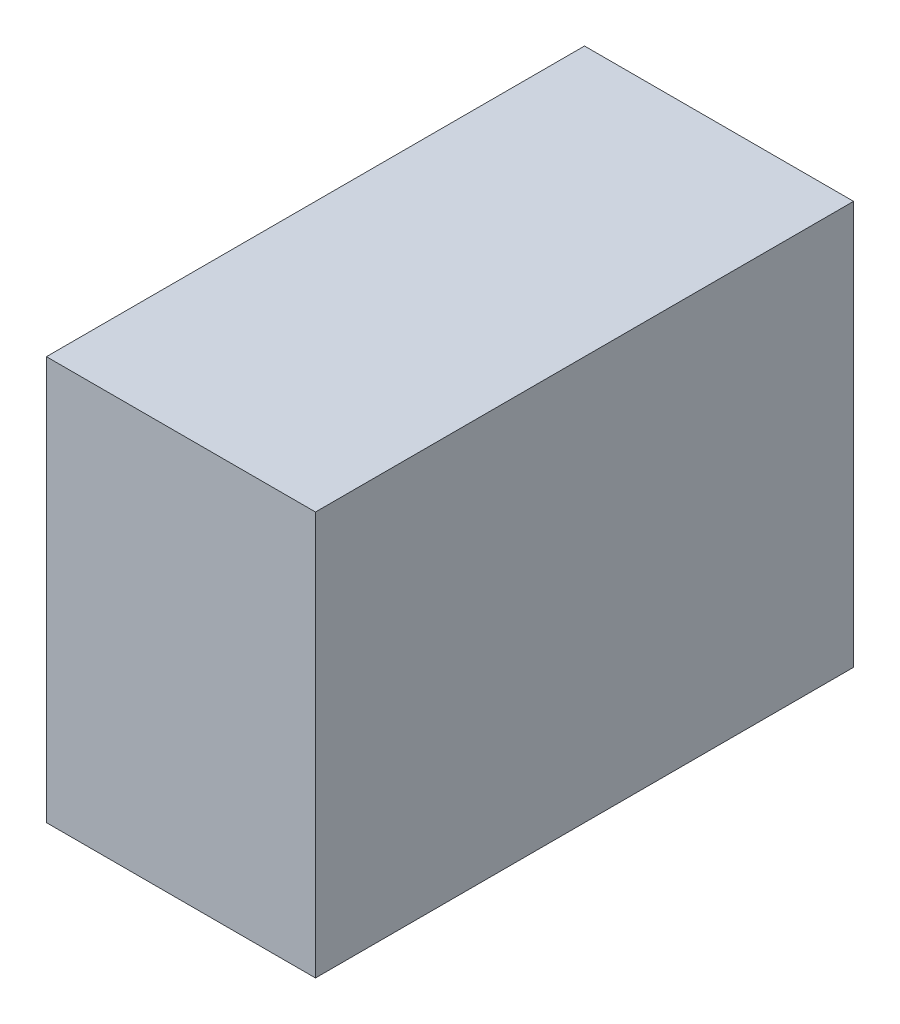
ISO-10303-21;
HEADER;
FILE_DESCRIPTION(('STEP AP214'),'2;1');
FILE_NAME('part.step','',(''),(''),'','','');
FILE_SCHEMA(('AUTOMOTIVE_DESIGN { 1 0 10303 214 1 1 1 1 }'));
ENDSEC;
DATA;
#1=APPLICATION_CONTEXT('core data for automotive mechanical design processes');
#2=APPLICATION_PROTOCOL_DEFINITION('international standard','automotive_design',2000,#1);
#3=PRODUCT_CONTEXT('',#1,'mechanical');
#4=PRODUCT('Part','Part','',(#3));
#5=PRODUCT_RELATED_PRODUCT_CATEGORY('part','',(#4));
#6=PRODUCT_DEFINITION_FORMATION('','',#4);
#7=PRODUCT_DEFINITION_CONTEXT('part definition',#1,'design');
#8=PRODUCT_DEFINITION('design','',#6,#7);
#9=PRODUCT_DEFINITION_SHAPE('','',#8);
#10=(LENGTH_UNIT() NAMED_UNIT(*) SI_UNIT(.MILLI.,.METRE.));
#11=(NAMED_UNIT(*) PLANE_ANGLE_UNIT() SI_UNIT($,.RADIAN.));
#12=(NAMED_UNIT(*) SI_UNIT($,.STERADIAN.) SOLID_ANGLE_UNIT());
#13=UNCERTAINTY_MEASURE_WITH_UNIT(LENGTH_MEASURE(1.E-05),#10,'distance_accuracy_value','');
#14=(GEOMETRIC_REPRESENTATION_CONTEXT(3) GLOBAL_UNCERTAINTY_ASSIGNED_CONTEXT((#13)) GLOBAL_UNIT_ASSIGNED_CONTEXT((#10,
#11,#12)) REPRESENTATION_CONTEXT('',''));
#15=CARTESIAN_POINT('',(0.,0.,0.));
#16=DIRECTION('',(0.,0.,1.));
#17=DIRECTION('',(1.,0.,0.));
#18=AXIS2_PLACEMENT_3D('',#15,#16,#17);
#19=CARTESIAN_POINT('',(0.,5.,0.));
#20=DIRECTION('',(0.,-1.,0.));
#21=DIRECTION('',(0.,0.,-1.));
#22=AXIS2_PLACEMENT_3D('',#19,#20,#21);
#23=CYLINDRICAL_SURFACE('',#22,2.5);
#24=CARTESIAN_POINT('',(0.,5.,0.));
#25=DIRECTION('',(0.,1.,0.));
#26=DIRECTION('',(0.,0.,1.));
#27=AXIS2_PLACEMENT_3D('',#24,#25,#26);
#28=CIRCLE('',#27,2.5);
#29=CARTESIAN_POINT('',(0.,5.,2.5));
#30=VERTEX_POINT('',#29);
#31=EDGE_CURVE('E11',#30,#30,#28,.T.);
#32=ORIENTED_EDGE('',*,*,#31,.F.);
#33=EDGE_LOOP('',(#32));
#34=FACE_BOUND('',#33,.T.);
#35=CARTESIAN_POINT('',(0.,0.,0.));
#36=DIRECTION('',(0.,1.,0.));
#37=DIRECTION('',(0.,0.,1.));
#38=AXIS2_PLACEMENT_3D('',#35,#36,#37);
#39=CIRCLE('',#38,2.5);
#40=CARTESIAN_POINT('',(0.,0.,2.5));
#41=VERTEX_POINT('',#40);
#42=EDGE_CURVE('E42',#41,#41,#39,.T.);
#43=ORIENTED_EDGE('',*,*,#42,.T.);
#44=EDGE_LOOP('',(#43));
#45=FACE_BOUND('',#44,.T.);
#46=ADVANCED_FACE('F39',(#34,#45),#23,.T.);
#47=CARTESIAN_POINT('',(0.,0.,0.));
#48=DIRECTION('',(0.,1.,0.));
#49=DIRECTION('',(0.,0.,1.));
#50=AXIS2_PLACEMENT_3D('',#47,#48,#49);
#51=PLANE('',#50);
#52=ORIENTED_EDGE('',*,*,#42,.F.);
#53=EDGE_LOOP('',(#52));
#54=FACE_BOUND('',#53,.T.);
#55=ADVANCED_FACE('F131',(#54),#51,.F.);
#56=CARTESIAN_POINT('',(15.,50.,-15.));
#57=DIRECTION('',(-1.,0.,0.));
#58=DIRECTION('',(0.,0.,1.));
#59=AXIS2_PLACEMENT_3D('',#56,#57,#58);
#60=PLANE('',#59);
#61=DIRECTION('',(0.,0.,-1.));
#62=VECTOR('',#61,1.);
#63=CARTESIAN_POINT('',(15.,5.,-15.));
#64=LINE('',#63,#62);
#65=CARTESIAN_POINT('',(15.,5.,45.));
#66=VERTEX_POINT('',#65);
#67=CARTESIAN_POINT('',(15.,5.,-15.));
#68=VERTEX_POINT('',#67);
#69=EDGE_CURVE('E111',#66,#68,#64,.T.);
#70=ORIENTED_EDGE('',*,*,#69,.T.);
#71=DIRECTION('',(0.,-1.,0.));
#72=VECTOR('',#71,1.);
#73=CARTESIAN_POINT('',(15.,50.,-15.));
#74=LINE('',#73,#72);
#75=CARTESIAN_POINT('',(15.,50.,-15.));
#76=VERTEX_POINT('',#75);
#77=EDGE_CURVE('E100',#76,#68,#74,.T.);
#78=ORIENTED_EDGE('',*,*,#77,.F.);
#79=DIRECTION('',(0.,0.,-1.));
#80=VECTOR('',#79,1.);
#81=CARTESIAN_POINT('',(15.,50.,-15.));
#82=LINE('',#81,#80);
#83=CARTESIAN_POINT('',(15.,50.,45.));
#84=VERTEX_POINT('',#83);
#85=EDGE_CURVE('E92',#84,#76,#82,.T.);
#86=ORIENTED_EDGE('',*,*,#85,.F.);
#87=DIRECTION('',(0.,-1.,0.));
#88=VECTOR('',#87,1.);
#89=CARTESIAN_POINT('',(15.,50.,45.));
#90=LINE('',#89,#88);
#91=EDGE_CURVE('E107',#84,#66,#90,.T.);
#92=ORIENTED_EDGE('',*,*,#91,.T.);
#93=EDGE_LOOP('',(#70,#78,#86,#92));
#94=FACE_BOUND('',#93,.T.);
#95=ADVANCED_FACE('F133',(#94),#60,.F.);
#96=CARTESIAN_POINT('',(15.,50.,-15.));
#97=DIRECTION('',(0.,0.,1.));
#98=DIRECTION('',(1.,0.,0.));
#99=AXIS2_PLACEMENT_3D('',#96,#97,#98);
#100=PLANE('',#99);
#101=DIRECTION('',(-1.,0.,0.));
#102=VECTOR('',#101,1.);
#103=CARTESIAN_POINT('',(15.,5.,-15.));
#104=LINE('',#103,#102);
#105=CARTESIAN_POINT('',(-15.,5.,-15.));
#106=VERTEX_POINT('',#105);
#107=EDGE_CURVE('E98',#68,#106,#104,.T.);
#108=ORIENTED_EDGE('',*,*,#107,.T.);
#109=DIRECTION('',(0.,-1.,0.));
#110=VECTOR('',#109,1.);
#111=CARTESIAN_POINT('',(-15.,50.,-15.));
#112=LINE('',#111,#110);
#113=CARTESIAN_POINT('',(-15.,50.,-15.));
#114=VERTEX_POINT('',#113);
#115=EDGE_CURVE('E96',#114,#106,#112,.T.);
#116=ORIENTED_EDGE('',*,*,#115,.F.);
#117=DIRECTION('',(-1.,0.,0.));
#118=VECTOR('',#117,1.);
#119=CARTESIAN_POINT('',(15.,50.,-15.));
#120=LINE('',#119,#118);
#121=EDGE_CURVE('E87',#76,#114,#120,.T.);
#122=ORIENTED_EDGE('',*,*,#121,.F.);
#123=ORIENTED_EDGE('',*,*,#77,.T.);
#124=EDGE_LOOP('',(#108,#116,#122,#123));
#125=FACE_BOUND('',#124,.T.);
#126=ADVANCED_FACE('F97',(#125),#100,.F.);
#127=CARTESIAN_POINT('',(-15.,50.,-15.));
#128=DIRECTION('',(1.,0.,0.));
#129=DIRECTION('',(0.,0.,-1.));
#130=AXIS2_PLACEMENT_3D('',#127,#128,#129);
#131=PLANE('',#130);
#132=DIRECTION('',(0.,0.,1.));
#133=VECTOR('',#132,1.);
#134=CARTESIAN_POINT('',(-15.,5.,-15.));
#135=LINE('',#134,#133);
#136=CARTESIAN_POINT('',(-15.,5.,45.));
#137=VERTEX_POINT('',#136);
#138=EDGE_CURVE('E73',#106,#137,#135,.T.);
#139=ORIENTED_EDGE('',*,*,#138,.T.);
#140=DIRECTION('',(0.,-1.,0.));
#141=VECTOR('',#140,1.);
#142=CARTESIAN_POINT('',(-15.,50.,45.));
#143=LINE('',#142,#141);
#144=CARTESIAN_POINT('',(-15.,50.,45.));
#145=VERTEX_POINT('',#144);
#146=EDGE_CURVE('E101',#145,#137,#143,.T.);
#147=ORIENTED_EDGE('',*,*,#146,.F.);
#148=DIRECTION('',(0.,0.,1.));
#149=VECTOR('',#148,1.);
#150=CARTESIAN_POINT('',(-15.,50.,-15.));
#151=LINE('',#150,#149);
#152=EDGE_CURVE('E90',#114,#145,#151,.T.);
#153=ORIENTED_EDGE('',*,*,#152,.F.);
#154=ORIENTED_EDGE('',*,*,#115,.T.);
#155=EDGE_LOOP('',(#139,#147,#153,#154));
#156=FACE_BOUND('',#155,.T.);
#157=ADVANCED_FACE('F103',(#156),#131,.F.);
#158=CARTESIAN_POINT('',(15.,50.,45.));
#159=DIRECTION('',(0.,0.,-1.));
#160=DIRECTION('',(-1.,0.,0.));
#161=AXIS2_PLACEMENT_3D('',#158,#159,#160);
#162=PLANE('',#161);
#163=DIRECTION('',(1.,0.,0.));
#164=VECTOR('',#163,1.);
#165=CARTESIAN_POINT('',(15.,5.,45.));
#166=LINE('',#165,#164);
#167=EDGE_CURVE('E79',#137,#66,#166,.T.);
#168=ORIENTED_EDGE('',*,*,#167,.T.);
#169=ORIENTED_EDGE('',*,*,#91,.F.);
#170=DIRECTION('',(1.,0.,0.));
#171=VECTOR('',#170,1.);
#172=CARTESIAN_POINT('',(15.,50.,45.));
#173=LINE('',#172,#171);
#174=EDGE_CURVE('E56',#145,#84,#173,.T.);
#175=ORIENTED_EDGE('',*,*,#174,.F.);
#176=ORIENTED_EDGE('',*,*,#146,.T.);
#177=EDGE_LOOP('',(#168,#169,#175,#176));
#178=FACE_BOUND('',#177,.T.);
#179=ADVANCED_FACE('F146',(#178),#162,.F.);
#180=CARTESIAN_POINT('',(0.,50.,0.));
#181=DIRECTION('',(0.,-1.,0.));
#182=DIRECTION('',(0.,0.,-1.));
#183=AXIS2_PLACEMENT_3D('',#180,#181,#182);
#184=PLANE('',#183);
#185=ORIENTED_EDGE('',*,*,#85,.T.);
#186=ORIENTED_EDGE('',*,*,#121,.T.);
#187=ORIENTED_EDGE('',*,*,#152,.T.);
#188=ORIENTED_EDGE('',*,*,#174,.T.);
#189=EDGE_LOOP('',(#185,#186,#187,#188));
#190=FACE_BOUND('',#189,.T.);
#191=ADVANCED_FACE('F88',(#190),#184,.F.);
#192=CARTESIAN_POINT('',(0.,5.,0.));
#193=DIRECTION('',(0.,-1.,0.));
#194=DIRECTION('',(0.,0.,-1.));
#195=AXIS2_PLACEMENT_3D('',#192,#193,#194);
#196=PLANE('',#195);
#197=ORIENTED_EDGE('',*,*,#31,.T.);
#198=EDGE_LOOP('',(#197));
#199=FACE_BOUND('',#198,.T.);
#200=ORIENTED_EDGE('',*,*,#69,.F.);
#201=ORIENTED_EDGE('',*,*,#167,.F.);
#202=ORIENTED_EDGE('',*,*,#138,.F.);
#203=ORIENTED_EDGE('',*,*,#107,.F.);
#204=EDGE_LOOP('',(#200,#201,#202,#203));
#205=FACE_BOUND('',#204,.T.);
#206=ADVANCED_FACE('F149',(#199,#205),#196,.T.);
#207=CLOSED_SHELL('',(#46,#55,#95,#126,#157,#179,#191,#206));
#208=MANIFOLD_SOLID_BREP('B2',#207);
#209=ADVANCED_BREP_SHAPE_REPRESENTATION('',(#18,#208),#14);
#210=SHAPE_DEFINITION_REPRESENTATION(#9,#209);
ENDSEC;
END-ISO-10303-21;
